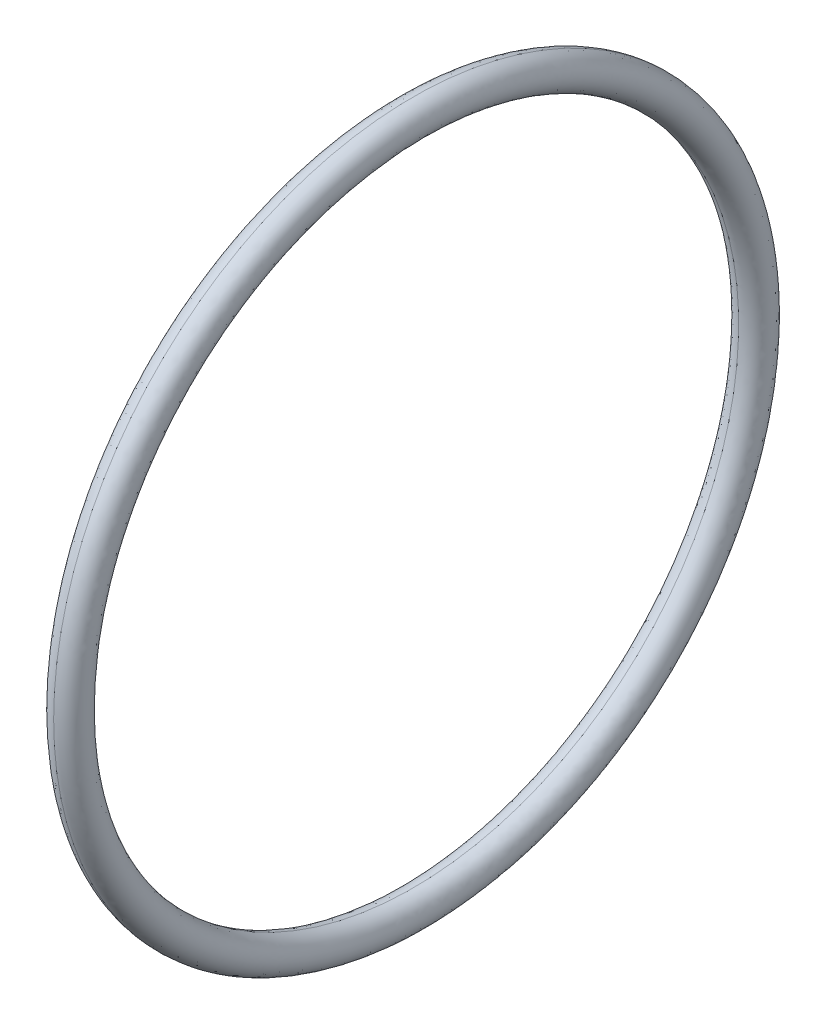
ISO-10303-21;
HEADER;
FILE_DESCRIPTION(('STEP AP214'),'2;1');
FILE_NAME('part.step','',(''),(''),'','','');
FILE_SCHEMA(('AUTOMOTIVE_DESIGN { 1 0 10303 214 1 1 1 1 }'));
ENDSEC;
DATA;
#1=APPLICATION_CONTEXT('core data for automotive mechanical design processes');
#2=APPLICATION_PROTOCOL_DEFINITION('international standard','automotive_design',2000,#1);
#3=PRODUCT_CONTEXT('',#1,'mechanical');
#4=PRODUCT('Part','Part','',(#3));
#5=PRODUCT_RELATED_PRODUCT_CATEGORY('part','',(#4));
#6=PRODUCT_DEFINITION_FORMATION('','',#4);
#7=PRODUCT_DEFINITION_CONTEXT('part definition',#1,'design');
#8=PRODUCT_DEFINITION('design','',#6,#7);
#9=PRODUCT_DEFINITION_SHAPE('','',#8);
#10=(LENGTH_UNIT() NAMED_UNIT(*) SI_UNIT(.MILLI.,.METRE.));
#11=(NAMED_UNIT(*) PLANE_ANGLE_UNIT() SI_UNIT($,.RADIAN.));
#12=(NAMED_UNIT(*) SI_UNIT($,.STERADIAN.) SOLID_ANGLE_UNIT());
#13=UNCERTAINTY_MEASURE_WITH_UNIT(LENGTH_MEASURE(1.E-05),#10,'distance_accuracy_value','');
#14=(GEOMETRIC_REPRESENTATION_CONTEXT(3) GLOBAL_UNCERTAINTY_ASSIGNED_CONTEXT((#13)) GLOBAL_UNIT_ASSIGNED_CONTEXT((#10,
#11,#12)) REPRESENTATION_CONTEXT('',''));
#15=CARTESIAN_POINT('',(0.,0.,0.));
#16=DIRECTION('',(0.,0.,1.));
#17=DIRECTION('',(1.,0.,0.));
#18=AXIS2_PLACEMENT_3D('',#15,#16,#17);
#19=CARTESIAN_POINT('',(0.,-15.25,15.9999999999999));
#20=CARTESIAN_POINT('',(1.50000000000001,-15.25,15.9999999999999));
#21=CARTESIAN_POINT('',(1.49999999999999,-15.25,14.4999999999999));
#22=CARTESIAN_POINT('',(0.,-15.25,14.4999999999999));
#23=(BOUNDED_CURVE() B_SPLINE_CURVE(3,(#19,#20,#21,#22),.UNSPECIFIED.,.F.,
.F.) B_SPLINE_CURVE_WITH_KNOTS((4,4),(0.,1.),
.UNSPECIFIED.) CURVE() GEOMETRIC_REPRESENTATION_ITEM() RATIONAL_B_SPLINE_CURVE((1.,
0.333333333333333,0.333333333333333,1.)) REPRESENTATION_ITEM(''));
#24=CARTESIAN_POINT('',(0.,-15.25,0.));
#25=DIRECTION('',(-1.,0.,0.));
#26=AXIS1_PLACEMENT('',#24,#25);
#27=SURFACE_OF_REVOLUTION('',#23,#26);
#28=CARTESIAN_POINT('',(0.,-15.25,0.));
#29=DIRECTION('',(-1.,0.,0.));
#30=DIRECTION('',(0.,0.,1.));
#31=AXIS2_PLACEMENT_3D('',#28,#29,#30);
#32=CIRCLE('',#31,14.5);
#33=CARTESIAN_POINT('',(0.,-15.25,14.5));
#34=VERTEX_POINT('',#33);
#35=EDGE_CURVE('E9',#34,#34,#32,.F.);
#36=ORIENTED_EDGE('',*,*,#35,.F.);
#37=EDGE_LOOP('',(#36));
#38=FACE_BOUND('',#37,.T.);
#39=CARTESIAN_POINT('',(0.,-15.25,0.));
#40=DIRECTION('',(-1.,0.,0.));
#41=DIRECTION('',(0.,0.,1.));
#42=AXIS2_PLACEMENT_3D('',#39,#40,#41);
#43=CIRCLE('',#42,16.);
#44=CARTESIAN_POINT('',(0.,-15.25,16.));
#45=VERTEX_POINT('',#44);
#46=EDGE_CURVE('E23',#45,#45,#43,.T.);
#47=ORIENTED_EDGE('',*,*,#46,.F.);
#48=EDGE_LOOP('',(#47));
#49=FACE_BOUND('',#48,.T.);
#50=ADVANCED_FACE('F14',(#38,#49),#27,.F.);
#51=CARTESIAN_POINT('',(0.,-15.25,14.5));
#52=CARTESIAN_POINT('',(-1.5,-15.25,14.5));
#53=CARTESIAN_POINT('',(-1.5,-15.25,16.));
#54=CARTESIAN_POINT('',(0.,-15.25,16.));
#55=(BOUNDED_CURVE() B_SPLINE_CURVE(3,(#51,#52,#53,#54),.UNSPECIFIED.,.F.,
.F.) B_SPLINE_CURVE_WITH_KNOTS((4,4),(0.,1.),
.UNSPECIFIED.) CURVE() GEOMETRIC_REPRESENTATION_ITEM() RATIONAL_B_SPLINE_CURVE((1.,
0.333333333333333,0.333333333333333,1.)) REPRESENTATION_ITEM(''));
#56=CARTESIAN_POINT('',(0.,-15.25,0.));
#57=DIRECTION('',(-1.,0.,0.));
#58=AXIS1_PLACEMENT('',#56,#57);
#59=SURFACE_OF_REVOLUTION('',#55,#58);
#60=ORIENTED_EDGE('',*,*,#46,.T.);
#61=EDGE_LOOP('',(#60));
#62=FACE_BOUND('',#61,.T.);
#63=ORIENTED_EDGE('',*,*,#35,.T.);
#64=EDGE_LOOP('',(#63));
#65=FACE_BOUND('',#64,.T.);
#66=ADVANCED_FACE('F35',(#62,#65),#59,.F.);
#67=CLOSED_SHELL('',(#50,#66));
#68=MANIFOLD_SOLID_BREP('B1',#67);
#69=ADVANCED_BREP_SHAPE_REPRESENTATION('',(#18,#68),#14);
#70=SHAPE_DEFINITION_REPRESENTATION(#9,#69);
ENDSEC;
END-ISO-10303-21;
